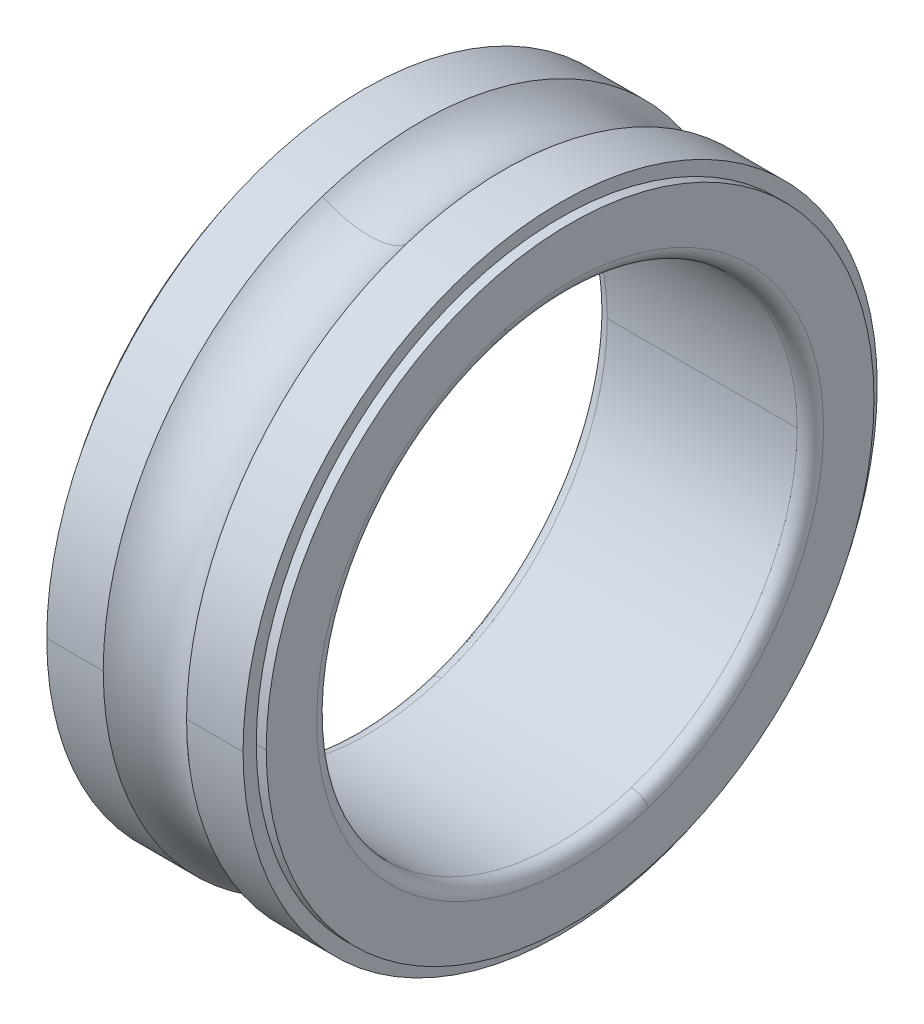
ISO-10303-21;
HEADER;
FILE_DESCRIPTION(('STEP AP214'),'2;1');
FILE_NAME('part.step','',(''),(''),'','','');
FILE_SCHEMA(('AUTOMOTIVE_DESIGN { 1 0 10303 214 1 1 1 1 }'));
ENDSEC;
DATA;
#1=APPLICATION_CONTEXT('core data for automotive mechanical design processes');
#2=APPLICATION_PROTOCOL_DEFINITION('international standard','automotive_design',2000,#1);
#3=PRODUCT_CONTEXT('',#1,'mechanical');
#4=PRODUCT('Part','Part','',(#3));
#5=PRODUCT_RELATED_PRODUCT_CATEGORY('part','',(#4));
#6=PRODUCT_DEFINITION_FORMATION('','',#4);
#7=PRODUCT_DEFINITION_CONTEXT('part definition',#1,'design');
#8=PRODUCT_DEFINITION('design','',#6,#7);
#9=PRODUCT_DEFINITION_SHAPE('','',#8);
#10=(LENGTH_UNIT() NAMED_UNIT(*) SI_UNIT(.MILLI.,.METRE.));
#11=(NAMED_UNIT(*) PLANE_ANGLE_UNIT() SI_UNIT($,.RADIAN.));
#12=(NAMED_UNIT(*) SI_UNIT($,.STERADIAN.) SOLID_ANGLE_UNIT());
#13=UNCERTAINTY_MEASURE_WITH_UNIT(LENGTH_MEASURE(1.E-05),#10,'distance_accuracy_value','');
#14=(GEOMETRIC_REPRESENTATION_CONTEXT(3) GLOBAL_UNCERTAINTY_ASSIGNED_CONTEXT((#13)) GLOBAL_UNIT_ASSIGNED_CONTEXT((#10,
#11,#12)) REPRESENTATION_CONTEXT('',''));
#15=CARTESIAN_POINT('',(0.,0.,0.));
#16=DIRECTION('',(0.,0.,1.));
#17=DIRECTION('',(1.,0.,0.));
#18=AXIS2_PLACEMENT_3D('',#15,#16,#17);
#19=CARTESIAN_POINT('',(0.,25.3,0.));
#20=DIRECTION('',(-1.,0.,0.));
#21=DIRECTION('',(0.,0.,1.));
#22=AXIS2_PLACEMENT_3D('',#19,#20,#21);
#23=PLANE('',#22);
#24=CARTESIAN_POINT('',(0.,0.,0.));
#25=DIRECTION('',(1.,0.,0.));
#26=DIRECTION('',(0.,0.,-1.));
#27=AXIS2_PLACEMENT_3D('',#24,#25,#26);
#28=CIRCLE('',#27,21.1);
#29=CARTESIAN_POINT('',(0.,20.0672924938281,6.5202585813115));
#30=VERTEX_POINT('',#29);
#31=CARTESIAN_POINT('',(0.,-20.0672924938281,-6.52025858131149));
#32=VERTEX_POINT('',#31);
#33=EDGE_CURVE('E11',#30,#32,#28,.T.);
#34=ORIENTED_EDGE('',*,*,#33,.T.);
#35=CARTESIAN_POINT('',(0.,-20.0672924938277,-6.52025858131139));
#36=CARTESIAN_POINT('',(0.,-19.0430510718525,-9.67239202122012));
#37=CARTESIAN_POINT('',(0.,-17.4001446138765,-12.6236072896446));
#38=CARTESIAN_POINT('',(0.,-15.1900988574075,-15.2110989527053));
#39=CARTESIAN_POINT('',(0.,-9.87458804758285,-19.379962845858));
#40=CARTESIAN_POINT('',(0.,-3.37752322544455,-21.2299259970769));
#41=CARTESIAN_POINT('',(0.,0.0148501207783876,-21.4969173544922));
#42=CARTESIAN_POINT('',(0.,6.72131360691236,-20.6860762361863));
#43=CARTESIAN_POINT('',(0.,12.6235569906424,-17.4001001484462));
#44=CARTESIAN_POINT('',(0.,15.2111110966231,-15.1901125797661));
#45=CARTESIAN_POINT('',(0.,19.3799658937177,-9.87458206582148));
#46=CARTESIAN_POINT('',(0.,21.2299077574398,-3.37752146660871));
#47=CARTESIAN_POINT('',(0.,21.4969828927928,0.0148355641550033));
#48=CARTESIAN_POINT('',(0.,21.0914413263433,3.36809505726355));
#49=CARTESIAN_POINT('',(0.,20.0672924938277,6.52025858131138));
#50=B_SPLINE_CURVE_WITH_KNOTS('',5,(#35,#36,#37,#38,#39,#40,#41,#42,#43,#44,#45,#46,#47,#48,
#49),.UNSPECIFIED.,.F.,.F.,(6,3,3,3,6),(0.,0.785398163397448,1.5707963267949,2.35619449019234,
3.14159265358979),.UNSPECIFIED.);
#51=EDGE_CURVE('E26',#32,#30,#50,.T.);
#52=ORIENTED_EDGE('',*,*,#51,.T.);
#53=EDGE_LOOP('',(#34,#52));
#54=FACE_BOUND('',#53,.T.);
#55=CARTESIAN_POINT('',(0.,0.,0.));
#56=DIRECTION('',(1.,0.,0.));
#57=DIRECTION('',(0.,0.,-1.));
#58=AXIS2_PLACEMENT_3D('',#55,#56,#57);
#59=CIRCLE('',#58,25.3);
#60=CARTESIAN_POINT('',(0.,0.,25.3));
#61=VERTEX_POINT('',#60);
#62=CARTESIAN_POINT('',(0.,0.,-25.3));
#63=VERTEX_POINT('',#62);
#64=EDGE_CURVE('E400',#61,#63,#59,.T.);
#65=ORIENTED_EDGE('',*,*,#64,.F.);
#66=CARTESIAN_POINT('',(0.,0.,0.));
#67=DIRECTION('',(1.,0.,0.));
#68=DIRECTION('',(0.,0.,-1.));
#69=AXIS2_PLACEMENT_3D('',#66,#67,#68);
#70=CIRCLE('',#69,25.3);
#71=EDGE_CURVE('E395',#63,#61,#70,.T.);
#72=ORIENTED_EDGE('',*,*,#71,.F.);
#73=EDGE_LOOP('',(#65,#72));
#74=FACE_BOUND('',#73,.T.);
#75=ADVANCED_FACE('F17',(#54,#74),#23,.T.);
#76=CARTESIAN_POINT('',(18.,0.,0.));
#77=DIRECTION('',(1.,0.,0.));
#78=DIRECTION('',(0.,-1.,0.));
#79=AXIS2_PLACEMENT_3D('',#76,#77,#78);
#80=CYLINDRICAL_SURFACE('',#79,25.3);
#81=DIRECTION('',(1.,0.,0.));
#82=VECTOR('',#81,1.);
#83=CARTESIAN_POINT('',(0.,0.,25.3));
#84=LINE('',#83,#82);
#85=CARTESIAN_POINT('',(0.827999999999999,0.,25.3));
#86=VERTEX_POINT('',#85);
#87=EDGE_CURVE('E391',#61,#86,#84,.T.);
#88=ORIENTED_EDGE('',*,*,#87,.T.);
#89=CARTESIAN_POINT('',(0.828,0.,0.));
#90=DIRECTION('',(1.,0.,0.));
#91=DIRECTION('',(0.,0.,-1.));
#92=AXIS2_PLACEMENT_3D('',#89,#90,#91);
#93=CIRCLE('',#92,25.3);
#94=CARTESIAN_POINT('',(0.828,0.,-25.3));
#95=VERTEX_POINT('',#94);
#96=EDGE_CURVE('E386',#95,#86,#93,.T.);
#97=ORIENTED_EDGE('',*,*,#96,.F.);
#98=DIRECTION('',(1.,0.,0.));
#99=VECTOR('',#98,1.);
#100=CARTESIAN_POINT('',(0.,0.,-25.3));
#101=LINE('',#100,#99);
#102=EDGE_CURVE('E381',#63,#95,#101,.T.);
#103=ORIENTED_EDGE('',*,*,#102,.F.);
#104=ORIENTED_EDGE('',*,*,#71,.T.);
#105=EDGE_LOOP('',(#88,#97,#103,#104));
#106=FACE_BOUND('',#105,.T.);
#107=ADVANCED_FACE('F421',(#106),#80,.T.);
#108=CARTESIAN_POINT('',(18.,0.,0.));
#109=DIRECTION('',(1.,0.,0.));
#110=DIRECTION('',(0.,1.,0.));
#111=AXIS2_PLACEMENT_3D('',#108,#109,#110);
#112=CYLINDRICAL_SURFACE('',#111,25.3);
#113=ORIENTED_EDGE('',*,*,#87,.F.);
#114=ORIENTED_EDGE('',*,*,#64,.T.);
#115=ORIENTED_EDGE('',*,*,#102,.T.);
#116=CARTESIAN_POINT('',(0.828,0.,0.));
#117=DIRECTION('',(1.,0.,0.));
#118=DIRECTION('',(0.,0.,-1.));
#119=AXIS2_PLACEMENT_3D('',#116,#117,#118);
#120=CIRCLE('',#119,25.3);
#121=EDGE_CURVE('E376',#86,#95,#120,.T.);
#122=ORIENTED_EDGE('',*,*,#121,.F.);
#123=EDGE_LOOP('',(#113,#114,#115,#122));
#124=FACE_BOUND('',#123,.T.);
#125=ADVANCED_FACE('F416',(#124),#112,.T.);
#126=CARTESIAN_POINT('',(0.828,26.4,0.));
#127=DIRECTION('',(-1.,0.,0.));
#128=DIRECTION('',(0.,0.,1.));
#129=AXIS2_PLACEMENT_3D('',#126,#127,#128);
#130=PLANE('',#129);
#131=ORIENTED_EDGE('',*,*,#96,.T.);
#132=ORIENTED_EDGE('',*,*,#121,.T.);
#133=EDGE_LOOP('',(#131,#132));
#134=FACE_BOUND('',#133,.T.);
#135=CARTESIAN_POINT('',(0.828,0.,0.));
#136=DIRECTION('',(1.,0.,0.));
#137=DIRECTION('',(0.,0.,-1.));
#138=AXIS2_PLACEMENT_3D('',#135,#136,#137);
#139=CIRCLE('',#138,26.4);
#140=CARTESIAN_POINT('',(0.827999999999996,0.,26.4));
#141=VERTEX_POINT('',#140);
#142=CARTESIAN_POINT('',(0.828,0.,-26.4));
#143=VERTEX_POINT('',#142);
#144=EDGE_CURVE('E371',#141,#143,#139,.T.);
#145=ORIENTED_EDGE('',*,*,#144,.F.);
#146=CARTESIAN_POINT('',(0.828,0.,0.));
#147=DIRECTION('',(1.,0.,0.));
#148=DIRECTION('',(0.,0.,-1.));
#149=AXIS2_PLACEMENT_3D('',#146,#147,#148);
#150=CIRCLE('',#149,26.4);
#151=EDGE_CURVE('E366',#143,#141,#150,.T.);
#152=ORIENTED_EDGE('',*,*,#151,.F.);
#153=EDGE_LOOP('',(#145,#152));
#154=FACE_BOUND('',#153,.T.);
#155=ADVANCED_FACE('F423',(#134,#154),#130,.T.);
#156=CARTESIAN_POINT('',(18.,0.,0.));
#157=DIRECTION('',(1.,0.,0.));
#158=DIRECTION('',(0.,-1.,0.));
#159=AXIS2_PLACEMENT_3D('',#156,#157,#158);
#160=CYLINDRICAL_SURFACE('',#159,26.4);
#161=DIRECTION('',(1.,0.,0.));
#162=VECTOR('',#161,1.);
#163=CARTESIAN_POINT('',(0.827999999999996,0.,26.4));
#164=LINE('',#163,#162);
#165=CARTESIAN_POINT('',(5.5301296854205,0.,26.4));
#166=VERTEX_POINT('',#165);
#167=EDGE_CURVE('E362',#141,#166,#164,.T.);
#168=ORIENTED_EDGE('',*,*,#167,.T.);
#169=CARTESIAN_POINT('',(5.5301296854205,0.,0.));
#170=DIRECTION('',(1.,0.,0.));
#171=DIRECTION('',(0.,0.,-1.));
#172=AXIS2_PLACEMENT_3D('',#169,#170,#171);
#173=CIRCLE('',#172,26.4);
#174=CARTESIAN_POINT('',(5.5301296854205,25.1078920301921,8.15804865149861));
#175=VERTEX_POINT('',#174);
#176=EDGE_CURVE('E357',#175,#166,#173,.T.);
#177=ORIENTED_EDGE('',*,*,#176,.F.);
#178=CARTESIAN_POINT('',(5.5301296854205,0.,0.));
#179=DIRECTION('',(1.,0.,0.));
#180=DIRECTION('',(0.,0.,-1.));
#181=AXIS2_PLACEMENT_3D('',#178,#179,#180);
#182=CIRCLE('',#181,26.4);
#183=CARTESIAN_POINT('',(5.5301296854205,0.,-26.4));
#184=VERTEX_POINT('',#183);
#185=EDGE_CURVE('E352',#184,#175,#182,.T.);
#186=ORIENTED_EDGE('',*,*,#185,.F.);
#187=DIRECTION('',(1.,0.,0.));
#188=VECTOR('',#187,1.);
#189=CARTESIAN_POINT('',(0.827999999999999,0.,-26.4));
#190=LINE('',#189,#188);
#191=EDGE_CURVE('E347',#143,#184,#190,.T.);
#192=ORIENTED_EDGE('',*,*,#191,.F.);
#193=ORIENTED_EDGE('',*,*,#151,.T.);
#194=EDGE_LOOP('',(#168,#177,#186,#192,#193));
#195=FACE_BOUND('',#194,.T.);
#196=ADVANCED_FACE('F426',(#195),#160,.T.);
#197=CARTESIAN_POINT('',(18.,0.,0.));
#198=DIRECTION('',(1.,0.,0.));
#199=DIRECTION('',(0.,1.,0.));
#200=AXIS2_PLACEMENT_3D('',#197,#198,#199);
#201=CYLINDRICAL_SURFACE('',#200,26.4);
#202=ORIENTED_EDGE('',*,*,#167,.F.);
#203=ORIENTED_EDGE('',*,*,#144,.T.);
#204=ORIENTED_EDGE('',*,*,#191,.T.);
#205=CARTESIAN_POINT('',(5.5301296854205,0.,0.));
#206=DIRECTION('',(1.,0.,0.));
#207=DIRECTION('',(0.,0.,-1.));
#208=AXIS2_PLACEMENT_3D('',#205,#206,#207);
#209=CIRCLE('',#208,26.4);
#210=CARTESIAN_POINT('',(5.5301296854205,-25.107892030192,-8.1580486514986));
#211=VERTEX_POINT('',#210);
#212=EDGE_CURVE('E342',#211,#184,#209,.T.);
#213=ORIENTED_EDGE('',*,*,#212,.F.);
#214=CARTESIAN_POINT('',(5.5301296854205,0.,0.));
#215=DIRECTION('',(1.,0.,0.));
#216=DIRECTION('',(0.,0.,-1.));
#217=AXIS2_PLACEMENT_3D('',#214,#215,#216);
#218=CIRCLE('',#217,26.4);
#219=EDGE_CURVE('E337',#166,#211,#218,.T.);
#220=ORIENTED_EDGE('',*,*,#219,.F.);
#221=EDGE_LOOP('',(#202,#203,#204,#213,#220));
#222=FACE_BOUND('',#221,.T.);
#223=ADVANCED_FACE('F432',(#222),#201,.T.);
#224=CARTESIAN_POINT('',(8.99999999999975,0.,0.));
#225=DIRECTION('',(1.,0.,0.));
#226=DIRECTION('',(0.,0.309016994374947,-0.951056516295154));
#227=AXIS2_PLACEMENT_3D('',#224,#225,#226);
#228=TOROIDAL_SURFACE('',#227,29.9999999999994,4.9999999999994);
#229=CARTESIAN_POINT('',(8.99999999999975,-28.531695488854,-9.27050983124823));
#230=DIRECTION('',(0.,0.309016994374947,-0.951056516295154));
#231=DIRECTION('',(-0.693974062915932,0.68476069173248,0.222492235949952));
#232=AXIS2_PLACEMENT_3D('',#229,#230,#231);
#233=CIRCLE('',#232,4.9999999999994);
#234=CARTESIAN_POINT('',(12.469870314579,-25.1078920301921,-8.15804865149861));
#235=VERTEX_POINT('',#234);
#236=EDGE_CURVE('E333',#211,#235,#233,.T.);
#237=ORIENTED_EDGE('',*,*,#236,.T.);
#238=CARTESIAN_POINT('',(12.469870314579,0.,0.));
#239=DIRECTION('',(1.,0.,0.));
#240=DIRECTION('',(0.,0.,-1.));
#241=AXIS2_PLACEMENT_3D('',#238,#239,#240);
#242=CIRCLE('',#241,26.4);
#243=CARTESIAN_POINT('',(12.469870314579,0.,26.4));
#244=VERTEX_POINT('',#243);
#245=EDGE_CURVE('E328',#244,#235,#242,.T.);
#246=ORIENTED_EDGE('',*,*,#245,.F.);
#247=CARTESIAN_POINT('',(12.469870314579,0.,0.));
#248=DIRECTION('',(1.,0.,0.));
#249=DIRECTION('',(0.,0.,-1.));
#250=AXIS2_PLACEMENT_3D('',#247,#248,#249);
#251=CIRCLE('',#250,26.4);
#252=CARTESIAN_POINT('',(12.469870314579,25.1078920301921,8.15804865149861));
#253=VERTEX_POINT('',#252);
#254=EDGE_CURVE('E323',#253,#244,#251,.T.);
#255=ORIENTED_EDGE('',*,*,#254,.F.);
#256=CARTESIAN_POINT('',(8.99999999999975,28.531695488854,9.27050983124824));
#257=DIRECTION('',(0.,-0.309016994374947,0.951056516295154));
#258=DIRECTION('',(-0.693974062915933,-0.68476069173248,-0.222492235949952));
#259=AXIS2_PLACEMENT_3D('',#256,#257,#258);
#260=CIRCLE('',#259,4.9999999999994);
#261=EDGE_CURVE('E318',#175,#253,#260,.T.);
#262=ORIENTED_EDGE('',*,*,#261,.F.);
#263=ORIENTED_EDGE('',*,*,#176,.T.);
#264=ORIENTED_EDGE('',*,*,#219,.T.);
#265=EDGE_LOOP('',(#237,#246,#255,#262,#263,#264));
#266=FACE_BOUND('',#265,.T.);
#267=ADVANCED_FACE('F439',(#266),#228,.F.);
#268=CARTESIAN_POINT('',(8.99999999999975,0.,0.));
#269=DIRECTION('',(1.,0.,0.));
#270=DIRECTION('',(0.,-0.309016994374947,0.951056516295154));
#271=AXIS2_PLACEMENT_3D('',#268,#269,#270);
#272=TOROIDAL_SURFACE('',#271,29.9999999999994,4.9999999999994);
#273=ORIENTED_EDGE('',*,*,#236,.F.);
#274=ORIENTED_EDGE('',*,*,#212,.T.);
#275=ORIENTED_EDGE('',*,*,#185,.T.);
#276=ORIENTED_EDGE('',*,*,#261,.T.);
#277=CARTESIAN_POINT('',(12.469870314579,0.,0.));
#278=DIRECTION('',(1.,0.,0.));
#279=DIRECTION('',(0.,0.,-1.));
#280=AXIS2_PLACEMENT_3D('',#277,#278,#279);
#281=CIRCLE('',#280,26.4);
#282=CARTESIAN_POINT('',(12.469870314579,0.,-26.4));
#283=VERTEX_POINT('',#282);
#284=EDGE_CURVE('E313',#283,#253,#281,.T.);
#285=ORIENTED_EDGE('',*,*,#284,.F.);
#286=CARTESIAN_POINT('',(12.469870314579,0.,0.));
#287=DIRECTION('',(1.,0.,0.));
#288=DIRECTION('',(0.,0.,-1.));
#289=AXIS2_PLACEMENT_3D('',#286,#287,#288);
#290=CIRCLE('',#289,26.4);
#291=EDGE_CURVE('E308',#235,#283,#290,.T.);
#292=ORIENTED_EDGE('',*,*,#291,.F.);
#293=EDGE_LOOP('',(#273,#274,#275,#276,#285,#292));
#294=FACE_BOUND('',#293,.T.);
#295=ADVANCED_FACE('F436',(#294),#272,.F.);
#296=CARTESIAN_POINT('',(18.,0.,0.));
#297=DIRECTION('',(1.,0.,0.));
#298=DIRECTION('',(0.,1.,0.));
#299=AXIS2_PLACEMENT_3D('',#296,#297,#298);
#300=CYLINDRICAL_SURFACE('',#299,26.4);
#301=DIRECTION('',(1.,0.,0.));
#302=VECTOR('',#301,1.);
#303=CARTESIAN_POINT('',(12.469870314579,0.,26.4));
#304=LINE('',#303,#302);
#305=CARTESIAN_POINT('',(17.172,0.,26.4));
#306=VERTEX_POINT('',#305);
#307=EDGE_CURVE('E303',#244,#306,#304,.T.);
#308=ORIENTED_EDGE('',*,*,#307,.F.);
#309=ORIENTED_EDGE('',*,*,#245,.T.);
#310=ORIENTED_EDGE('',*,*,#291,.T.);
#311=DIRECTION('',(1.,0.,0.));
#312=VECTOR('',#311,1.);
#313=CARTESIAN_POINT('',(12.469870314579,0.,-26.4));
#314=LINE('',#313,#312);
#315=CARTESIAN_POINT('',(17.172,0.,-26.4));
#316=VERTEX_POINT('',#315);
#317=EDGE_CURVE('E299',#283,#316,#314,.T.);
#318=ORIENTED_EDGE('',*,*,#317,.T.);
#319=CARTESIAN_POINT('',(17.172,0.,0.));
#320=DIRECTION('',(1.,0.,0.));
#321=DIRECTION('',(0.,0.,-1.));
#322=AXIS2_PLACEMENT_3D('',#319,#320,#321);
#323=CIRCLE('',#322,26.4);
#324=EDGE_CURVE('E294',#306,#316,#323,.T.);
#325=ORIENTED_EDGE('',*,*,#324,.F.);
#326=EDGE_LOOP('',(#308,#309,#310,#318,#325));
#327=FACE_BOUND('',#326,.T.);
#328=ADVANCED_FACE('F445',(#327),#300,.T.);
#329=CARTESIAN_POINT('',(17.172,25.3,0.));
#330=DIRECTION('',(1.,0.,0.));
#331=DIRECTION('',(0.,0.,-1.));
#332=AXIS2_PLACEMENT_3D('',#329,#330,#331);
#333=PLANE('',#332);
#334=CARTESIAN_POINT('',(17.172,0.,0.));
#335=DIRECTION('',(1.,0.,0.));
#336=DIRECTION('',(0.,0.,-1.));
#337=AXIS2_PLACEMENT_3D('',#334,#335,#336);
#338=CIRCLE('',#337,26.4);
#339=EDGE_CURVE('E289',#316,#306,#338,.T.);
#340=ORIENTED_EDGE('',*,*,#339,.T.);
#341=ORIENTED_EDGE('',*,*,#324,.T.);
#342=EDGE_LOOP('',(#340,#341));
#343=FACE_BOUND('',#342,.T.);
#344=CARTESIAN_POINT('',(17.172,0.,0.));
#345=DIRECTION('',(1.,0.,0.));
#346=DIRECTION('',(0.,0.,-1.));
#347=AXIS2_PLACEMENT_3D('',#344,#345,#346);
#348=CIRCLE('',#347,25.3);
#349=CARTESIAN_POINT('',(17.172,0.,25.3));
#350=VERTEX_POINT('',#349);
#351=CARTESIAN_POINT('',(17.172,0.,-25.3));
#352=VERTEX_POINT('',#351);
#353=EDGE_CURVE('E284',#350,#352,#348,.T.);
#354=ORIENTED_EDGE('',*,*,#353,.F.);
#355=CARTESIAN_POINT('',(17.172,0.,0.));
#356=DIRECTION('',(1.,0.,0.));
#357=DIRECTION('',(0.,0.,-1.));
#358=AXIS2_PLACEMENT_3D('',#355,#356,#357);
#359=CIRCLE('',#358,25.3);
#360=EDGE_CURVE('E279',#352,#350,#359,.T.);
#361=ORIENTED_EDGE('',*,*,#360,.F.);
#362=EDGE_LOOP('',(#354,#361));
#363=FACE_BOUND('',#362,.T.);
#364=ADVANCED_FACE('F449',(#343,#363),#333,.T.);
#365=CARTESIAN_POINT('',(18.,0.,0.));
#366=DIRECTION('',(1.,0.,0.));
#367=DIRECTION('',(0.,-1.,0.));
#368=AXIS2_PLACEMENT_3D('',#365,#366,#367);
#369=CYLINDRICAL_SURFACE('',#368,25.3);
#370=DIRECTION('',(1.,0.,0.));
#371=VECTOR('',#370,1.);
#372=CARTESIAN_POINT('',(17.172,0.,25.3));
#373=LINE('',#372,#371);
#374=CARTESIAN_POINT('',(18.,0.,25.3));
#375=VERTEX_POINT('',#374);
#376=EDGE_CURVE('E275',#350,#375,#373,.T.);
#377=ORIENTED_EDGE('',*,*,#376,.T.);
#378=CARTESIAN_POINT('',(18.,0.,0.));
#379=DIRECTION('',(1.,0.,0.));
#380=DIRECTION('',(0.,0.,-1.));
#381=AXIS2_PLACEMENT_3D('',#378,#379,#380);
#382=CIRCLE('',#381,25.3);
#383=CARTESIAN_POINT('',(18.,0.,-25.3));
#384=VERTEX_POINT('',#383);
#385=EDGE_CURVE('E270',#384,#375,#382,.T.);
#386=ORIENTED_EDGE('',*,*,#385,.F.);
#387=DIRECTION('',(1.,0.,0.));
#388=VECTOR('',#387,1.);
#389=CARTESIAN_POINT('',(17.172,0.,-25.3));
#390=LINE('',#389,#388);
#391=EDGE_CURVE('E265',#352,#384,#390,.T.);
#392=ORIENTED_EDGE('',*,*,#391,.F.);
#393=ORIENTED_EDGE('',*,*,#360,.T.);
#394=EDGE_LOOP('',(#377,#386,#392,#393));
#395=FACE_BOUND('',#394,.T.);
#396=ADVANCED_FACE('F452',(#395),#369,.T.);
#397=CARTESIAN_POINT('',(18.,0.,0.));
#398=DIRECTION('',(1.,0.,0.));
#399=DIRECTION('',(0.,1.,0.));
#400=AXIS2_PLACEMENT_3D('',#397,#398,#399);
#401=CYLINDRICAL_SURFACE('',#400,25.3);
#402=ORIENTED_EDGE('',*,*,#376,.F.);
#403=ORIENTED_EDGE('',*,*,#353,.T.);
#404=ORIENTED_EDGE('',*,*,#391,.T.);
#405=CARTESIAN_POINT('',(18.,0.,0.));
#406=DIRECTION('',(1.,0.,0.));
#407=DIRECTION('',(0.,0.,-1.));
#408=AXIS2_PLACEMENT_3D('',#405,#406,#407);
#409=CIRCLE('',#408,25.3);
#410=EDGE_CURVE('E262',#375,#384,#409,.T.);
#411=ORIENTED_EDGE('',*,*,#410,.F.);
#412=EDGE_LOOP('',(#402,#403,#404,#411));
#413=FACE_BOUND('',#412,.T.);
#414=ADVANCED_FACE('F458',(#413),#401,.T.);
#415=CARTESIAN_POINT('',(18.,21.1,0.));
#416=DIRECTION('',(1.,0.,0.));
#417=DIRECTION('',(0.,0.,-1.));
#418=AXIS2_PLACEMENT_3D('',#415,#416,#417);
#419=PLANE('',#418);
#420=ORIENTED_EDGE('',*,*,#385,.T.);
#421=ORIENTED_EDGE('',*,*,#410,.T.);
#422=EDGE_LOOP('',(#420,#421));
#423=FACE_BOUND('',#422,.T.);
#424=CARTESIAN_POINT('',(18.,-20.0672924938284,-6.52025858131164));
#425=CARTESIAN_POINT('',(18.,-19.9606118696683,-6.84861148160539));
#426=CARTESIAN_POINT('',(18.,-19.8458588268025,-7.17434083883172));
#427=CARTESIAN_POINT('',(18.,-19.6005144463527,-7.8197791952024));
#428=CARTESIAN_POINT('',(18.,-19.4699231087687,-8.13948819434676));
#429=CARTESIAN_POINT('',(18.,-19.1932086815757,-8.77211256260641));
#430=CARTESIAN_POINT('',(18.,-19.0470855919665,-9.0850279317217));
#431=CARTESIAN_POINT('',(18.,-18.7396618445937,-9.70331202064574));
#432=CARTESIAN_POINT('',(18.,-18.5783611868299,-10.0086807404545));
#433=CARTESIAN_POINT('',(18.,-18.2409703116433,-10.6111356507177));
#434=CARTESIAN_POINT('',(18.,-18.0648800942204,-10.9082218411722));
#435=CARTESIAN_POINT('',(18.,-17.6983344715934,-11.4933960450359));
#436=CARTESIAN_POINT('',(18.,-17.5078790663893,-11.781484058445));
#437=CARTESIAN_POINT('',(18.,-17.1130618503885,-12.347967863161));
#438=CARTESIAN_POINT('',(18.,-16.9087000395918,-12.6263636544679));
#439=CARTESIAN_POINT('',(18.,-16.4865623490452,-13.1727923393667));
#440=CARTESIAN_POINT('',(18.,-16.2687864692952,-13.4408252329587));
#441=CARTESIAN_POINT('',(18.,-15.8203452790271,-13.965882406576));
#442=CARTESIAN_POINT('',(18.,-15.589679968509,-14.2229066866013));
#443=CARTESIAN_POINT('',(18.,-15.1160156104411,-14.7253274393858));
#444=CARTESIAN_POINT('',(18.,-14.8730165628913,-14.9707239121451));
#445=CARTESIAN_POINT('',(18.,-14.3752701365355,-15.4492978687191));
#446=CARTESIAN_POINT('',(18.,-14.1205227577296,-15.6824753525338));
#447=CARTESIAN_POINT('',(18.,-13.5998933776677,-16.1360495862581));
#448=CARTESIAN_POINT('',(18.,-13.3340113764118,-16.3564463361677));
#449=CARTESIAN_POINT('',(18.,-12.7917532844641,-16.7839281470008));
#450=CARTESIAN_POINT('',(18.,-12.5153771937723,-16.9910132079244));
#451=CARTESIAN_POINT('',(18.,-11.9527967371673,-17.3913727547368));
#452=CARTESIAN_POINT('',(18.,-11.6665923712541,-17.5846472406256));
#453=CARTESIAN_POINT('',(18.,-11.0850448555909,-17.9569200222028));
#454=CARTESIAN_POINT('',(18.,-10.789701705841,-18.1359183178912));
#455=CARTESIAN_POINT('',(18.,-10.1905881300217,-18.4792074964948));
#456=CARTESIAN_POINT('',(18.,-9.88681770395224,-18.6434983794101));
#457=CARTESIAN_POINT('',(18.,-9.27158138505725,-18.9569769413403));
#458=CARTESIAN_POINT('',(18.,-8.96011549223172,-19.1061646203553));
#459=CARTESIAN_POINT('',(18.,-8.33023858844158,-19.3890773682991));
#460=CARTESIAN_POINT('',(18.,-8.01182757747698,-19.5228024372278));
#461=CARTESIAN_POINT('',(18.,-7.36882751742363,-19.774467809595));
#462=CARTESIAN_POINT('',(18.,-7.04423846833489,-19.8924081130335));
#463=CARTESIAN_POINT('',(18.,-6.38966429548315,-20.1122198258988));
#464=CARTESIAN_POINT('',(18.,-6.05967917172016,-20.2140912353257));
#465=CARTESIAN_POINT('',(18.,-5.39510781258636,-20.4015197430196));
#466=CARTESIAN_POINT('',(18.,-5.06052157721555,-20.4870768412867));
#467=CARTESIAN_POINT('',(18.,-4.38755404241341,-20.6416706121174));
#468=CARTESIAN_POINT('',(18.,-4.04917274298208,-20.710707284681));
#469=CARTESIAN_POINT('',(18.,-3.36943027024794,-20.8320938887138));
#470=CARTESIAN_POINT('',(18.,-3.02806909694513,-20.8844438201829));
#471=CARTESIAN_POINT('',(18.,-2.34318924543421,-20.9723308264563));
#472=CARTESIAN_POINT('',(18.,-1.9996705672261,-21.0078679012607));
#473=CARTESIAN_POINT('',(18.,-1.31130327248908,-21.0620435822787));
#474=CARTESIAN_POINT('',(18.,-0.966454655960164,-21.0806821884924));
#475=CARTESIAN_POINT('',(18.,-0.276258255103927,-21.1010160302943));
#476=CARTESIAN_POINT('',(18.,0.0690895292233964,-21.1027112658824));
#477=CARTESIAN_POINT('',(18.,0.759452292615127,-21.0891542824621));
#478=CARTESIAN_POINT('',(18.,1.10446727167954,-21.0739020634537));
#479=CARTESIAN_POINT('',(18.,1.79333325324111,-21.0264869147718));
#480=CARTESIAN_POINT('',(18.,2.13718425573829,-20.9943239850983));
#481=CARTESIAN_POINT('',(18.,2.82289391698259,-20.913164898401));
#482=CARTESIAN_POINT('',(18.,3.16475257572973,-20.8641687413772));
#483=CARTESIAN_POINT('',(18.,3.84565398202176,-20.7494612360131));
#484=CARTESIAN_POINT('',(18.,4.18469672956666,-20.6837498876728));
#485=CARTESIAN_POINT('',(18.,4.85914952977874,-20.5357703040694));
#486=CARTESIAN_POINT('',(18.,5.19455958244592,-20.4535020688064));
#487=CARTESIAN_POINT('',(18.,5.86093896070725,-20.2726069027423));
#488=CARTESIAN_POINT('',(18.,6.19190828630139,-20.1739799719411));
#489=CARTESIAN_POINT('',(18.,6.84860887632178,-19.9606050157157));
#490=CARTESIAN_POINT('',(18.,7.17434014074804,-19.8458569902915));
#491=CARTESIAN_POINT('',(18.,7.81977989328597,-19.6005162828638));
#492=CARTESIAN_POINT('',(18.,8.13948838139765,-19.4699236008604));
#493=CARTESIAN_POINT('',(18.,8.77211237555542,-19.193208189484));
#494=CARTESIAN_POINT('',(18.,9.0850278816015,-19.047085460111));
#495=CARTESIAN_POINT('',(18.,9.70331207076584,-18.7396619764493));
#496=CARTESIAN_POINT('',(18.,10.0086807538841,-18.5783612221606));
#497=CARTESIAN_POINT('',(18.,10.611135637288,-18.2409702763127));
#498=CARTESIAN_POINT('',(18.,10.9082218375737,-18.0648800847537));
#499=CARTESIAN_POINT('',(18.,11.4933960486343,-17.6983344810603));
#500=CARTESIAN_POINT('',(18.,11.7814840594092,-17.507879068926));
#501=CARTESIAN_POINT('',(18.,12.3479678621968,-17.1130618478519));
#502=CARTESIAN_POINT('',(18.,12.6263636542095,-16.9087000389121));
#503=CARTESIAN_POINT('',(18.,13.172792339625,-16.4865623497249));
#504=CARTESIAN_POINT('',(18.,13.4408252330279,-16.2687864694774));
#505=CARTESIAN_POINT('',(18.,13.9658824065067,-15.820345278845));
#506=CARTESIAN_POINT('',(18.,14.2229066865827,-15.5896799684602));
#507=CARTESIAN_POINT('',(18.,14.7253274394043,-15.1160156104899));
#508=CARTESIAN_POINT('',(18.,14.97072391215,-14.8730165629044));
#509=CARTESIAN_POINT('',(18.,15.4492978687141,-14.3752701365225));
#510=CARTESIAN_POINT('',(18.,15.6824753525325,-14.1205227577261));
#511=CARTESIAN_POINT('',(18.,16.1360495862594,-13.5998933776712));
#512=CARTESIAN_POINT('',(18.,16.356446336168,-13.3340113764127));
#513=CARTESIAN_POINT('',(18.,16.7839281470004,-12.7917532844632));
#514=CARTESIAN_POINT('',(18.,16.9910132079243,-12.5153771937721));
#515=CARTESIAN_POINT('',(18.,17.3913727547369,-11.9527967371676));
#516=CARTESIAN_POINT('',(18.,17.5846472406256,-11.6665923712542));
#517=CARTESIAN_POINT('',(18.,17.9569200222028,-11.0850448555909));
#518=CARTESIAN_POINT('',(18.,18.1359183178911,-10.7897017058411));
#519=CARTESIAN_POINT('',(18.,18.4792074964948,-10.1905881300218));
#520=CARTESIAN_POINT('',(18.,18.64349837941,-9.8868177039523));
#521=CARTESIAN_POINT('',(18.,18.9569769413403,-9.27158138505731));
#522=CARTESIAN_POINT('',(18.,19.1061646203553,-8.96011549223178));
#523=CARTESIAN_POINT('',(18.,19.3890773682991,-8.33023858844163));
#524=CARTESIAN_POINT('',(18.,19.5228024372279,-8.01182757747702));
#525=CARTESIAN_POINT('',(18.,19.7744678095949,-7.36882751742371));
#526=CARTESIAN_POINT('',(18.,19.8924081130332,-7.04423846833501));
#527=CARTESIAN_POINT('',(18.,20.112219825899,-6.38966429548313));
#528=CARTESIAN_POINT('',(18.,20.2140912353266,-6.05967917171995));
#529=CARTESIAN_POINT('',(18.,20.4015197430186,-5.39510781258668));
#530=CARTESIAN_POINT('',(18.,20.487076841283,-5.06052157721658));
#531=CARTESIAN_POINT('',(18.,20.641670612121,-4.38755404241248));
#532=CARTESIAN_POINT('',(18.,20.7107072846945,-4.04917274297847));
#533=CARTESIAN_POINT('',(18.,20.8320938887003,-3.36943027025166));
#534=CARTESIAN_POINT('',(18.,20.8844438201325,-3.02806909695886));
#535=CARTESIAN_POINT('',(18.,20.9723308265067,-2.34318924542059));
#536=CARTESIAN_POINT('',(18.,21.0078679014487,-1.99967056717512));
#537=CARTESIAN_POINT('',(18.,21.0620435820907,-1.31130327254019));
#538=CARTESIAN_POINT('',(18.,21.0806821877907,-0.96645465615073));
#539=CARTESIAN_POINT('',(18.,21.101016030996,-0.276258254913507));
#540=CARTESIAN_POINT('',(18.,21.1027112685013,0.0690895299342561));
#541=CARTESIAN_POINT('',(18.,21.0891542798432,0.759452291904127));
#542=CARTESIAN_POINT('',(18.,21.0739020536798,1.10446726902623));
#543=CARTESIAN_POINT('',(18.,21.0264869245457,1.79333325589428));
#544=CARTESIAN_POINT('',(18.,20.9943240215751,2.13718426564021));
#545=CARTESIAN_POINT('',(18.,20.9131648619242,2.82289390708056));
#546=CARTESIAN_POINT('',(18.,20.8641686052439,3.16475253877498));
#547=CARTESIAN_POINT('',(18.,20.7494613721464,3.84565401897642));
#548=CARTESIAN_POINT('',(18.,20.6837503957291,4.18469686748344));
#549=CARTESIAN_POINT('',(18.,20.5357697960131,4.85914939186186));
#550=CARTESIAN_POINT('',(18.,20.4535001727145,5.19455906773327));
#551=CARTESIAN_POINT('',(18.,20.2726087988342,5.86093947541979));
#552=CARTESIAN_POINT('',(18.,20.1739870482525,6.1919102072349));
#553=CARTESIAN_POINT('',(18.,20.0672924938284,6.52025858131153));
#554=B_SPLINE_CURVE_WITH_KNOTS('',3,(#424,#425,#426,#427,#428,#429,#430,#431,#432,#433,#434,
#435,#436,#437,#438,#439,#440,#441,#442,#443,#444,#445,#446,#447,#448,#449,#450,#451,#452,#453,
#454,#455,#456,#457,#458,#459,#460,#461,#462,#463,#464,#465,#466,#467,#468,#469,#470,#471,#472,
#473,#474,#475,#476,#477,#478,#479,#480,#481,#482,#483,#484,#485,#486,#487,#488,#489,#490,#491,
#492,#493,#494,#495,#496,#497,#498,#499,#500,#501,#502,#503,#504,#505,#506,#507,#508,#509,#510,
#511,#512,#513,#514,#515,#516,#517,#518,#519,#520,#521,#522,#523,#524,#525,#526,#527,#528,#529,
#530,#531,#532,#533,#534,#535,#536,#537,#538,#539,#540,#541,#542,#543,#544,#545,#546,#547,#548,
#549,#550,#551,#552,#553),.UNSPECIFIED.,.F.,.F.,(4,2,2,2,2,2,2,2,2,2,2,2,2,2,2,2,2,2,2,2,2,2,2,
2,2,2,2,2,2,2,2,2,2,2,2,2,2,2,2,2,2,2,2,2,2,2,2,2,2,2,2,2,2,2,2,2,2,2,2,2,2,2,2,2,4),(0.,
1.03563984366693,2.07127968733386,3.10691953100079,4.14255937466772,5.17819921833465,
6.21383906200158,7.24947890566851,8.28511874933545,9.32075859300238,10.3563984366693,
11.3920382803362,12.4276781240032,13.4633179676701,14.498957811337,15.534597655004,
16.5702374986709,17.6058773423378,18.6415171860048,19.6771570296717,20.7127968733386,
21.7484367170055,22.7840765606725,23.8197164043394,24.8553562480063,25.8909960916733,
26.9266359353402,27.9622757790071,28.9979156226741,30.033555466341,31.0691953100079,
32.1048351536749,33.1404749973418,34.1761148410087,35.2117546846757,36.2473945283426,
37.2830343720095,38.3186742156765,39.3543140593434,40.3899539030103,41.4255937466773,
42.4612335903442,43.4968734340111,44.532513277678,45.568153121345,46.6037929650119,
47.6394328086788,48.6750726523458,49.7107124960127,50.7463523396796,51.7819921833466,
52.8176320270135,53.8532718706804,54.8889117143474,55.9245515580143,56.9601914016812,
57.9958312453481,59.0314710890151,60.067110932682,61.1027507763489,62.1383906200159,
63.1740304636828,64.2096703073497,65.2453101510167,66.2809499946836),.UNSPECIFIED.);
#555=CARTESIAN_POINT('',(18.,-20.0672924938284,-6.5202585813116));
#556=VERTEX_POINT('',#555);
#557=CARTESIAN_POINT('',(18.,20.0672924938284,6.52025858131161));
#558=VERTEX_POINT('',#557);
#559=EDGE_CURVE('E261',#556,#558,#554,.T.);
#560=ORIENTED_EDGE('',*,*,#559,.F.);
#561=CARTESIAN_POINT('',(18.,20.0672924938284,6.52025858131165));
#562=CARTESIAN_POINT('',(18.,19.9606118696683,6.8486114816054));
#563=CARTESIAN_POINT('',(18.,19.8458588268025,7.17434083883172));
#564=CARTESIAN_POINT('',(18.,19.6005144463527,7.8197791952024));
#565=CARTESIAN_POINT('',(18.,19.4699231087687,8.13948819434676));
#566=CARTESIAN_POINT('',(18.,19.1932086815757,8.77211256260641));
#567=CARTESIAN_POINT('',(18.,19.0470855919665,9.0850279317217));
#568=CARTESIAN_POINT('',(18.,18.7396618445937,9.70331202064574));
#569=CARTESIAN_POINT('',(18.,18.5783611868299,10.0086807404545));
#570=CARTESIAN_POINT('',(18.,18.2409703116433,10.6111356507177));
#571=CARTESIAN_POINT('',(18.,18.0648800942204,10.9082218411722));
#572=CARTESIAN_POINT('',(18.,17.6983344715934,11.4933960450359));
#573=CARTESIAN_POINT('',(18.,17.5078790663893,11.7814840584451));
#574=CARTESIAN_POINT('',(18.,17.1130618503885,12.347967863161));
#575=CARTESIAN_POINT('',(18.,16.9087000395918,12.6263636544679));
#576=CARTESIAN_POINT('',(18.,16.4865623490451,13.1727923393667));
#577=CARTESIAN_POINT('',(18.,16.2687864692952,13.4408252329587));
#578=CARTESIAN_POINT('',(18.,15.8203452790271,13.965882406576));
#579=CARTESIAN_POINT('',(18.,15.589679968509,14.2229066866013));
#580=CARTESIAN_POINT('',(18.,15.116015610441,14.7253274393858));
#581=CARTESIAN_POINT('',(18.,14.8730165628913,14.9707239121451));
#582=CARTESIAN_POINT('',(18.,14.3752701365355,15.4492978687191));
#583=CARTESIAN_POINT('',(18.,14.1205227577295,15.6824753525338));
#584=CARTESIAN_POINT('',(18.,13.5998933776677,16.1360495862581));
#585=CARTESIAN_POINT('',(18.,13.3340113764117,16.3564463361677));
#586=CARTESIAN_POINT('',(18.,12.7917532844641,16.7839281470009));
#587=CARTESIAN_POINT('',(18.,12.5153771937723,16.9910132079244));
#588=CARTESIAN_POINT('',(18.,11.9527967371673,17.3913727547368));
#589=CARTESIAN_POINT('',(18.,11.666592371254,17.5846472406257));
#590=CARTESIAN_POINT('',(18.,11.0850448555909,17.9569200222028));
#591=CARTESIAN_POINT('',(18.,10.789701705841,18.1359183178912));
#592=CARTESIAN_POINT('',(18.,10.1905881300217,18.4792074964948));
#593=CARTESIAN_POINT('',(18.,9.88681770395223,18.6434983794101));
#594=CARTESIAN_POINT('',(18.,9.27158138505725,18.9569769413403));
#595=CARTESIAN_POINT('',(18.,8.96011549223171,19.1061646203553));
#596=CARTESIAN_POINT('',(18.,8.33023858844157,19.3890773682991));
#597=CARTESIAN_POINT('',(18.,8.01182757747697,19.5228024372278));
#598=CARTESIAN_POINT('',(18.,7.36882751742362,19.774467809595));
#599=CARTESIAN_POINT('',(18.,7.04423846833487,19.8924081130335));
#600=CARTESIAN_POINT('',(18.,6.38966429548313,20.1122198258988));
#601=CARTESIAN_POINT('',(18.,6.05967917172014,20.2140912353257));
#602=CARTESIAN_POINT('',(18.,5.39510781258634,20.4015197430196));
#603=CARTESIAN_POINT('',(18.,5.06052157721553,20.4870768412867));
#604=CARTESIAN_POINT('',(18.,4.38755404241338,20.6416706121174));
#605=CARTESIAN_POINT('',(18.,4.04917274298205,20.710707284681));
#606=CARTESIAN_POINT('',(18.,3.3694302702479,20.8320938887138));
#607=CARTESIAN_POINT('',(18.,3.02806909694509,20.8844438201829));
#608=CARTESIAN_POINT('',(18.,2.34318924543417,20.9723308264563));
#609=CARTESIAN_POINT('',(18.,1.99967056722607,21.0078679012607));
#610=CARTESIAN_POINT('',(18.,1.31130327248905,21.0620435822787));
#611=CARTESIAN_POINT('',(18.,0.966454655960141,21.0806821884924));
#612=CARTESIAN_POINT('',(18.,0.276258255103904,21.1010160302943));
#613=CARTESIAN_POINT('',(18.,-0.0690895292234226,21.1027112658824));
#614=CARTESIAN_POINT('',(18.,-0.759452292615154,21.0891542824621));
#615=CARTESIAN_POINT('',(18.,-1.10446727167956,21.0739020634537));
#616=CARTESIAN_POINT('',(18.,-1.79333325324114,21.0264869147718));
#617=CARTESIAN_POINT('',(18.,-2.13718425573831,20.9943239850983));
#618=CARTESIAN_POINT('',(18.,-2.82289391698262,20.913164898401));
#619=CARTESIAN_POINT('',(18.,-3.16475257572976,20.8641687413772));
#620=CARTESIAN_POINT('',(18.,-3.84565398202179,20.7494612360131));
#621=CARTESIAN_POINT('',(18.,-4.18469672956669,20.6837498876728));
#622=CARTESIAN_POINT('',(18.,-4.85914952977878,20.5357703040694));
#623=CARTESIAN_POINT('',(18.,-5.19455958244596,20.4535020688064));
#624=CARTESIAN_POINT('',(18.,-5.86093896070728,20.2726069027422));
#625=CARTESIAN_POINT('',(18.,-6.19190828630142,20.1739799719411));
#626=CARTESIAN_POINT('',(18.,-6.84860887632181,19.9606050157157));
#627=CARTESIAN_POINT('',(18.,-7.17434014074807,19.8458569902914));
#628=CARTESIAN_POINT('',(18.,-7.81977989328601,19.6005162828638));
#629=CARTESIAN_POINT('',(18.,-8.13948838139769,19.4699236008604));
#630=CARTESIAN_POINT('',(18.,-8.77211237555544,19.193208189484));
#631=CARTESIAN_POINT('',(18.,-9.08502788160152,19.047085460111));
#632=CARTESIAN_POINT('',(18.,-9.70331207076587,18.7396619764493));
#633=CARTESIAN_POINT('',(18.,-10.0086807538841,18.5783612221605));
#634=CARTESIAN_POINT('',(18.,-10.6111356372881,18.2409702763127));
#635=CARTESIAN_POINT('',(18.,-10.9082218375737,18.0648800847536));
#636=CARTESIAN_POINT('',(18.,-11.4933960486343,17.6983344810603));
#637=CARTESIAN_POINT('',(18.,-11.7814840594092,17.5078790689259));
#638=CARTESIAN_POINT('',(18.,-12.3479678621968,17.1130618478519));
#639=CARTESIAN_POINT('',(18.,-12.6263636542095,16.9087000389121));
#640=CARTESIAN_POINT('',(18.,-13.172792339625,16.4865623497249));
#641=CARTESIAN_POINT('',(18.,-13.4408252330279,16.2687864694773));
#642=CARTESIAN_POINT('',(18.,-13.9658824065068,15.820345278845));
#643=CARTESIAN_POINT('',(18.,-14.2229066865827,15.5896799684602));
#644=CARTESIAN_POINT('',(18.,-14.7253274394044,15.1160156104899));
#645=CARTESIAN_POINT('',(18.,-14.9707239121501,14.8730165629044));
#646=CARTESIAN_POINT('',(18.,-15.4492978687141,14.3752701365225));
#647=CARTESIAN_POINT('',(18.,-15.6824753525325,14.1205227577261));
#648=CARTESIAN_POINT('',(18.,-16.1360495862595,13.5998933776712));
#649=CARTESIAN_POINT('',(18.,-16.3564463361681,13.3340113764127));
#650=CARTESIAN_POINT('',(18.,-16.7839281470005,12.7917532844632));
#651=CARTESIAN_POINT('',(18.,-16.9910132079243,12.5153771937721));
#652=CARTESIAN_POINT('',(18.,-17.3913727547369,11.9527967371676));
#653=CARTESIAN_POINT('',(18.,-17.5846472406257,11.6665923712541));
#654=CARTESIAN_POINT('',(18.,-17.9569200222028,11.0850448555908));
#655=CARTESIAN_POINT('',(18.,-18.1359183178912,10.789701705841));
#656=CARTESIAN_POINT('',(18.,-18.4792074964948,10.1905881300217));
#657=CARTESIAN_POINT('',(18.,-18.6434983794101,9.88681770395225));
#658=CARTESIAN_POINT('',(18.,-18.9569769413403,9.27158138505726));
#659=CARTESIAN_POINT('',(18.,-19.1061646203553,8.96011549223174));
#660=CARTESIAN_POINT('',(18.,-19.3890773682991,8.3302385884416));
#661=CARTESIAN_POINT('',(18.,-19.5228024372279,8.01182757747698));
#662=CARTESIAN_POINT('',(18.,-19.7744678095949,7.36882751742367));
#663=CARTESIAN_POINT('',(18.,-19.8924081130332,7.04423846833498));
#664=CARTESIAN_POINT('',(18.,-20.1122198258991,6.38966429548309));
#665=CARTESIAN_POINT('',(18.,-20.2140912353266,6.0596791717199));
#666=CARTESIAN_POINT('',(18.,-20.4015197430186,5.39510781258662));
#667=CARTESIAN_POINT('',(18.,-20.4870768412831,5.06052157721653));
#668=CARTESIAN_POINT('',(18.,-20.641670612121,4.38755404241243));
#669=CARTESIAN_POINT('',(18.,-20.7107072846945,4.04917274297842));
#670=CARTESIAN_POINT('',(18.,-20.8320938887003,3.3694302702516));
#671=CARTESIAN_POINT('',(18.,-20.8844438201325,3.0280690969588));
#672=CARTESIAN_POINT('',(18.,-20.9723308265067,2.34318924542053));
#673=CARTESIAN_POINT('',(18.,-21.0078679014487,1.99967056717506));
#674=CARTESIAN_POINT('',(18.,-21.0620435820907,1.31130327254013));
#675=CARTESIAN_POINT('',(18.,-21.0806821877907,0.966454656150672));
#676=CARTESIAN_POINT('',(18.,-21.101016030996,0.276258254913449));
#677=CARTESIAN_POINT('',(18.,-21.1027112685013,-0.0690895299343147));
#678=CARTESIAN_POINT('',(18.,-21.0891542798432,-0.759452291904185));
#679=CARTESIAN_POINT('',(18.,-21.0739020536798,-1.10446726902629));
#680=CARTESIAN_POINT('',(18.,-21.0264869245457,-1.79333325589433));
#681=CARTESIAN_POINT('',(18.,-20.9943240215751,-2.13718426564027));
#682=CARTESIAN_POINT('',(18.,-20.9131648619242,-2.82289390708062));
#683=CARTESIAN_POINT('',(18.,-20.8641686052439,-3.16475253877504));
#684=CARTESIAN_POINT('',(18.,-20.7494613721464,-3.84565401897647));
#685=CARTESIAN_POINT('',(18.,-20.6837503957291,-4.18469686748349));
#686=CARTESIAN_POINT('',(18.,-20.5357697960131,-4.85914939186192));
#687=CARTESIAN_POINT('',(18.,-20.4535001727145,-5.19455906773333));
#688=CARTESIAN_POINT('',(18.,-20.2726087988342,-5.86093947541985));
#689=CARTESIAN_POINT('',(18.,-20.1739870482525,-6.19191020723496));
#690=CARTESIAN_POINT('',(18.,-20.0672924938284,-6.52025858131159));
#691=B_SPLINE_CURVE_WITH_KNOTS('',3,(#561,#562,#563,#564,#565,#566,#567,#568,#569,#570,#571,
#572,#573,#574,#575,#576,#577,#578,#579,#580,#581,#582,#583,#584,#585,#586,#587,#588,#589,#590,
#591,#592,#593,#594,#595,#596,#597,#598,#599,#600,#601,#602,#603,#604,#605,#606,#607,#608,#609,
#610,#611,#612,#613,#614,#615,#616,#617,#618,#619,#620,#621,#622,#623,#624,#625,#626,#627,#628,
#629,#630,#631,#632,#633,#634,#635,#636,#637,#638,#639,#640,#641,#642,#643,#644,#645,#646,#647,
#648,#649,#650,#651,#652,#653,#654,#655,#656,#657,#658,#659,#660,#661,#662,#663,#664,#665,#666,
#667,#668,#669,#670,#671,#672,#673,#674,#675,#676,#677,#678,#679,#680,#681,#682,#683,#684,#685,
#686,#687,#688,#689,#690),.UNSPECIFIED.,.F.,.F.,(4,2,2,2,2,2,2,2,2,2,2,2,2,2,2,2,2,2,2,2,2,2,2,
2,2,2,2,2,2,2,2,2,2,2,2,2,2,2,2,2,2,2,2,2,2,2,2,2,2,2,2,2,2,2,2,2,2,2,2,2,2,2,2,2,4),(0.,
1.03563984366693,2.07127968733386,3.10691953100079,4.14255937466773,5.17819921833466,
6.21383906200159,7.24947890566852,8.28511874933546,9.32075859300238,10.3563984366693,
11.3920382803363,12.4276781240032,13.4633179676701,14.498957811337,15.534597655004,
16.5702374986709,17.6058773423378,18.6415171860048,19.6771570296717,20.7127968733386,
21.7484367170056,22.7840765606725,23.8197164043394,24.8553562480064,25.8909960916733,
26.9266359353402,27.9622757790072,28.9979156226741,30.033555466341,31.069195310008,
32.1048351536749,33.1404749973418,34.1761148410088,35.2117546846757,36.2473945283426,
37.2830343720095,38.3186742156765,39.3543140593434,40.3899539030104,41.4255937466773,
42.4612335903442,43.4968734340111,44.5325132776781,45.568153121345,46.6037929650119,
47.6394328086789,48.6750726523458,49.7107124960127,50.7463523396797,51.7819921833466,
52.8176320270135,53.8532718706805,54.8889117143474,55.9245515580143,56.9601914016813,
57.9958312453482,59.0314710890151,60.067110932682,61.102750776349,62.1383906200159,
63.1740304636828,64.2096703073498,65.2453101510167,66.2809499946837),.UNSPECIFIED.);
#692=EDGE_CURVE('E224',#558,#556,#691,.T.);
#693=ORIENTED_EDGE('',*,*,#692,.F.);
#694=EDGE_LOOP('',(#560,#693));
#695=FACE_BOUND('',#694,.T.);
#696=ADVANCED_FACE('F209',(#423,#695),#419,.T.);
#697=CARTESIAN_POINT('',(16.8999999999993,0.,0.));
#698=DIRECTION('',(1.,0.,0.));
#699=DIRECTION('',(0.,0.309016994374947,-0.951056516295154));
#700=AXIS2_PLACEMENT_3D('',#697,#698,#699);
#701=TOROIDAL_SURFACE('',#700,21.1000000000007,1.10000000000069);
#702=CARTESIAN_POINT('',(16.8999999999993,-20.0672924938284,-6.5202585813116));
#703=DIRECTION('',(0.,0.309016994374947,-0.951056516295154));
#704=DIRECTION('',(6.36258722475689E-13,0.951056516295154,0.309016994374947));
#705=AXIS2_PLACEMENT_3D('',#702,#703,#704);
#706=CIRCLE('',#705,1.10000000000069);
#707=CARTESIAN_POINT('',(16.9,-19.0211303259031,-6.18033988749895));
#708=VERTEX_POINT('',#707);
#709=EDGE_CURVE('E235',#708,#556,#706,.T.);
#710=ORIENTED_EDGE('',*,*,#709,.F.);
#711=CARTESIAN_POINT('',(16.9,0.,0.));
#712=DIRECTION('',(1.,0.,0.));
#713=DIRECTION('',(0.,0.,-1.));
#714=AXIS2_PLACEMENT_3D('',#711,#712,#713);
#715=CIRCLE('',#714,20.);
#716=CARTESIAN_POINT('',(16.9,0.,20.));
#717=VERTEX_POINT('',#716);
#718=EDGE_CURVE('E230',#717,#708,#715,.T.);
#719=ORIENTED_EDGE('',*,*,#718,.F.);
#720=CARTESIAN_POINT('',(16.9,0.,0.));
#721=DIRECTION('',(1.,0.,0.));
#722=DIRECTION('',(0.,0.,-1.));
#723=AXIS2_PLACEMENT_3D('',#720,#721,#722);
#724=CIRCLE('',#723,20.);
#725=CARTESIAN_POINT('',(16.9,19.0211303259031,6.18033988749895));
#726=VERTEX_POINT('',#725);
#727=EDGE_CURVE('E226',#726,#717,#724,.T.);
#728=ORIENTED_EDGE('',*,*,#727,.F.);
#729=CARTESIAN_POINT('',(16.8999999999993,20.0672924938284,6.52025858131161));
#730=DIRECTION('',(0.,-0.309016994374947,0.951056516295154));
#731=DIRECTION('',(6.33028982767691E-13,-0.951056516295154,-0.309016994374947));
#732=AXIS2_PLACEMENT_3D('',#729,#730,#731);
#733=CIRCLE('',#732,1.10000000000069);
#734=EDGE_CURVE('E183',#726,#558,#733,.T.);
#735=ORIENTED_EDGE('',*,*,#734,.T.);
#736=ORIENTED_EDGE('',*,*,#692,.T.);
#737=EDGE_LOOP('',(#710,#719,#728,#735,#736));
#738=FACE_BOUND('',#737,.T.);
#739=ADVANCED_FACE('F203',(#738),#701,.T.);
#740=CARTESIAN_POINT('',(16.8999999999993,0.,0.));
#741=DIRECTION('',(1.,0.,0.));
#742=DIRECTION('',(0.,-0.309016994374947,0.951056516295154));
#743=AXIS2_PLACEMENT_3D('',#740,#741,#742);
#744=TOROIDAL_SURFACE('',#743,21.1000000000007,1.10000000000069);
#745=ORIENTED_EDGE('',*,*,#709,.T.);
#746=ORIENTED_EDGE('',*,*,#559,.T.);
#747=ORIENTED_EDGE('',*,*,#734,.F.);
#748=CARTESIAN_POINT('',(16.9,0.,0.));
#749=DIRECTION('',(1.,0.,0.));
#750=DIRECTION('',(0.,0.,-1.));
#751=AXIS2_PLACEMENT_3D('',#748,#749,#750);
#752=CIRCLE('',#751,20.);
#753=CARTESIAN_POINT('',(16.9,0.,-20.));
#754=VERTEX_POINT('',#753);
#755=EDGE_CURVE('E178',#754,#726,#752,.T.);
#756=ORIENTED_EDGE('',*,*,#755,.F.);
#757=CARTESIAN_POINT('',(16.9,0.,0.));
#758=DIRECTION('',(1.,0.,0.));
#759=DIRECTION('',(0.,0.,-1.));
#760=AXIS2_PLACEMENT_3D('',#757,#758,#759);
#761=CIRCLE('',#760,20.);
#762=EDGE_CURVE('E173',#708,#754,#761,.T.);
#763=ORIENTED_EDGE('',*,*,#762,.F.);
#764=EDGE_LOOP('',(#745,#746,#747,#756,#763));
#765=FACE_BOUND('',#764,.T.);
#766=ADVANCED_FACE('F192',(#765),#744,.T.);
#767=CARTESIAN_POINT('',(18.,0.,0.));
#768=DIRECTION('',(1.,0.,0.));
#769=DIRECTION('',(0.,1.,0.));
#770=AXIS2_PLACEMENT_3D('',#767,#768,#769);
#771=CYLINDRICAL_SURFACE('',#770,20.);
#772=DIRECTION('',(1.,0.,0.));
#773=VECTOR('',#772,1.);
#774=CARTESIAN_POINT('',(1.1,0.,20.));
#775=LINE('',#774,#773);
#776=CARTESIAN_POINT('',(1.1,0.,20.));
#777=VERTEX_POINT('',#776);
#778=EDGE_CURVE('E149',#777,#717,#775,.T.);
#779=ORIENTED_EDGE('',*,*,#778,.T.);
#780=ORIENTED_EDGE('',*,*,#718,.T.);
#781=ORIENTED_EDGE('',*,*,#762,.T.);
#782=DIRECTION('',(1.,0.,0.));
#783=VECTOR('',#782,1.);
#784=CARTESIAN_POINT('',(1.1,0.,-20.));
#785=LINE('',#784,#783);
#786=CARTESIAN_POINT('',(1.1,0.,-20.));
#787=VERTEX_POINT('',#786);
#788=EDGE_CURVE('E166',#787,#754,#785,.T.);
#789=ORIENTED_EDGE('',*,*,#788,.F.);
#790=CARTESIAN_POINT('',(1.1,0.,0.));
#791=DIRECTION('',(1.,0.,0.));
#792=DIRECTION('',(0.,0.,-1.));
#793=AXIS2_PLACEMENT_3D('',#790,#791,#792);
#794=CIRCLE('',#793,20.);
#795=CARTESIAN_POINT('',(1.1,-19.0211303259031,-6.18033988749894));
#796=VERTEX_POINT('',#795);
#797=EDGE_CURVE('E141',#796,#787,#794,.T.);
#798=ORIENTED_EDGE('',*,*,#797,.F.);
#799=CARTESIAN_POINT('',(1.1,0.,0.));
#800=DIRECTION('',(1.,0.,0.));
#801=DIRECTION('',(0.,0.,-1.));
#802=AXIS2_PLACEMENT_3D('',#799,#800,#801);
#803=CIRCLE('',#802,20.);
#804=EDGE_CURVE('E159',#777,#796,#803,.T.);
#805=ORIENTED_EDGE('',*,*,#804,.F.);
#806=EDGE_LOOP('',(#779,#780,#781,#789,#798,#805));
#807=FACE_BOUND('',#806,.T.);
#808=ADVANCED_FACE('F202',(#807),#771,.F.);
#809=CARTESIAN_POINT('',(1.10000000000035,0.,0.));
#810=DIRECTION('',(1.,0.,0.));
#811=DIRECTION('',(0.,0.309016994374947,-0.951056516295154));
#812=AXIS2_PLACEMENT_3D('',#809,#810,#811);
#813=TOROIDAL_SURFACE('',#812,21.1000000000003,1.10000000000035);
#814=CARTESIAN_POINT('',(1.10000000000035,-20.0672924938281,-6.52025858131149));
#815=DIRECTION('',(0.,0.309016994374947,-0.951056516295154));
#816=DIRECTION('',(-1.,0.,0.));
#817=AXIS2_PLACEMENT_3D('',#814,#815,#816);
#818=CIRCLE('',#817,1.10000000000035);
#819=EDGE_CURVE('E134',#32,#796,#818,.T.);
#820=ORIENTED_EDGE('',*,*,#819,.F.);
#821=ORIENTED_EDGE('',*,*,#33,.F.);
#822=CARTESIAN_POINT('',(1.10000000000035,20.0672924938281,6.5202585813115));
#823=DIRECTION('',(0.,-0.309016994374947,0.951056516295154));
#824=DIRECTION('',(-1.,0.,0.));
#825=AXIS2_PLACEMENT_3D('',#822,#823,#824);
#826=CIRCLE('',#825,1.10000000000035);
#827=CARTESIAN_POINT('',(1.1,19.0211303259031,6.18033988749895));
#828=VERTEX_POINT('',#827);
#829=EDGE_CURVE('E127',#30,#828,#826,.T.);
#830=ORIENTED_EDGE('',*,*,#829,.T.);
#831=CARTESIAN_POINT('',(1.1,0.,0.));
#832=DIRECTION('',(1.,0.,0.));
#833=DIRECTION('',(0.,0.,-1.));
#834=AXIS2_PLACEMENT_3D('',#831,#832,#833);
#835=CIRCLE('',#834,20.);
#836=EDGE_CURVE('E132',#828,#777,#835,.T.);
#837=ORIENTED_EDGE('',*,*,#836,.T.);
#838=ORIENTED_EDGE('',*,*,#804,.T.);
#839=EDGE_LOOP('',(#820,#821,#830,#837,#838));
#840=FACE_BOUND('',#839,.T.);
#841=ADVANCED_FACE('F129',(#840),#813,.T.);
#842=CARTESIAN_POINT('',(18.,0.,0.));
#843=DIRECTION('',(1.,0.,0.));
#844=DIRECTION('',(0.,-1.,0.));
#845=AXIS2_PLACEMENT_3D('',#842,#843,#844);
#846=CYLINDRICAL_SURFACE('',#845,20.);
#847=ORIENTED_EDGE('',*,*,#778,.F.);
#848=ORIENTED_EDGE('',*,*,#836,.F.);
#849=CARTESIAN_POINT('',(1.1,0.,0.));
#850=DIRECTION('',(1.,0.,0.));
#851=DIRECTION('',(0.,0.,-1.));
#852=AXIS2_PLACEMENT_3D('',#849,#850,#851);
#853=CIRCLE('',#852,20.);
#854=EDGE_CURVE('E138',#787,#828,#853,.T.);
#855=ORIENTED_EDGE('',*,*,#854,.F.);
#856=ORIENTED_EDGE('',*,*,#788,.T.);
#857=ORIENTED_EDGE('',*,*,#755,.T.);
#858=ORIENTED_EDGE('',*,*,#727,.T.);
#859=EDGE_LOOP('',(#847,#848,#855,#856,#857,#858));
#860=FACE_BOUND('',#859,.T.);
#861=ADVANCED_FACE('F146',(#860),#846,.F.);
#862=CARTESIAN_POINT('',(1.10000000000035,0.,0.));
#863=DIRECTION('',(1.,0.,0.));
#864=DIRECTION('',(0.,-0.309016994374947,0.951056516295154));
#865=AXIS2_PLACEMENT_3D('',#862,#863,#864);
#866=TOROIDAL_SURFACE('',#865,21.1000000000003,1.10000000000035);
#867=ORIENTED_EDGE('',*,*,#819,.T.);
#868=ORIENTED_EDGE('',*,*,#797,.T.);
#869=ORIENTED_EDGE('',*,*,#854,.T.);
#870=ORIENTED_EDGE('',*,*,#829,.F.);
#871=ORIENTED_EDGE('',*,*,#51,.F.);
#872=EDGE_LOOP('',(#867,#868,#869,#870,#871));
#873=FACE_BOUND('',#872,.T.);
#874=ADVANCED_FACE('F140',(#873),#866,.T.);
#875=CARTESIAN_POINT('',(18.,0.,0.));
#876=DIRECTION('',(1.,0.,0.));
#877=DIRECTION('',(0.,-1.,0.));
#878=AXIS2_PLACEMENT_3D('',#875,#876,#877);
#879=CYLINDRICAL_SURFACE('',#878,26.4);
#880=ORIENTED_EDGE('',*,*,#307,.T.);
#881=ORIENTED_EDGE('',*,*,#339,.F.);
#882=ORIENTED_EDGE('',*,*,#317,.F.);
#883=ORIENTED_EDGE('',*,*,#284,.T.);
#884=ORIENTED_EDGE('',*,*,#254,.T.);
#885=EDGE_LOOP('',(#880,#881,#882,#883,#884));
#886=FACE_BOUND('',#885,.T.);
#887=ADVANCED_FACE('F447',(#886),#879,.T.);
#888=CLOSED_SHELL('',(#75,#107,#125,#155,#196,#223,#267,#295,#328,#364,#396,#414,#696,#739,#766,
#808,#841,#861,#874,#887));
#889=MANIFOLD_SOLID_BREP('B1',#888);
#890=ADVANCED_BREP_SHAPE_REPRESENTATION('',(#18,#889),#14);
#891=SHAPE_DEFINITION_REPRESENTATION(#9,#890);
ENDSEC;
END-ISO-10303-21;
